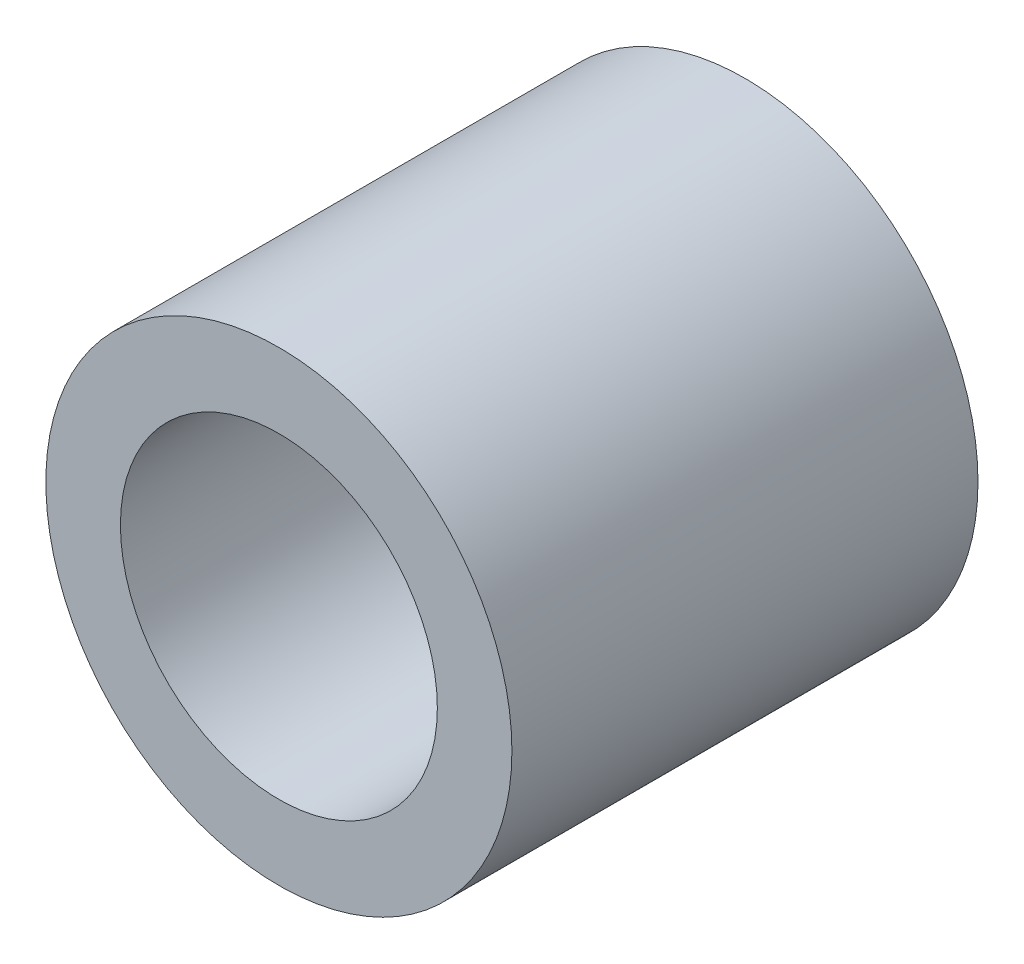
ISO-10303-21;
HEADER;
FILE_DESCRIPTION(('STEP AP214'),'2;1');
FILE_NAME('part.step','',(''),(''),'','','');
FILE_SCHEMA(('AUTOMOTIVE_DESIGN { 1 0 10303 214 1 1 1 1 }'));
ENDSEC;
DATA;
#1=APPLICATION_CONTEXT('core data for automotive mechanical design processes');
#2=APPLICATION_PROTOCOL_DEFINITION('international standard','automotive_design',2000,#1);
#3=PRODUCT_CONTEXT('',#1,'mechanical');
#4=PRODUCT('Part','Part','',(#3));
#5=PRODUCT_RELATED_PRODUCT_CATEGORY('part','',(#4));
#6=PRODUCT_DEFINITION_FORMATION('','',#4);
#7=PRODUCT_DEFINITION_CONTEXT('part definition',#1,'design');
#8=PRODUCT_DEFINITION('design','',#6,#7);
#9=PRODUCT_DEFINITION_SHAPE('','',#8);
#10=(LENGTH_UNIT() NAMED_UNIT(*) SI_UNIT(.MILLI.,.METRE.));
#11=(NAMED_UNIT(*) PLANE_ANGLE_UNIT() SI_UNIT($,.RADIAN.));
#12=(NAMED_UNIT(*) SI_UNIT($,.STERADIAN.) SOLID_ANGLE_UNIT());
#13=UNCERTAINTY_MEASURE_WITH_UNIT(LENGTH_MEASURE(1.E-05),#10,'distance_accuracy_value','');
#14=(GEOMETRIC_REPRESENTATION_CONTEXT(3) GLOBAL_UNCERTAINTY_ASSIGNED_CONTEXT((#13)) GLOBAL_UNIT_ASSIGNED_CONTEXT((#10,
#11,#12)) REPRESENTATION_CONTEXT('',''));
#15=CARTESIAN_POINT('',(0.,0.,0.));
#16=DIRECTION('',(0.,0.,1.));
#17=DIRECTION('',(1.,0.,0.));
#18=AXIS2_PLACEMENT_3D('',#15,#16,#17);
#19=CARTESIAN_POINT('',(0.,0.,2.5));
#20=DIRECTION('',(0.,0.,1.));
#21=DIRECTION('',(1.,0.,0.));
#22=AXIS2_PLACEMENT_3D('',#19,#20,#21);
#23=PLANE('',#22);
#24=CARTESIAN_POINT('',(0.,0.,2.5));
#25=DIRECTION('',(0.,0.,1.));
#26=DIRECTION('',(1.,0.,0.));
#27=AXIS2_PLACEMENT_3D('',#24,#25,#26);
#28=CIRCLE('',#27,2.5);
#29=CARTESIAN_POINT('',(2.5,0.,2.5));
#30=VERTEX_POINT('',#29);
#31=EDGE_CURVE('E10',#30,#30,#28,.T.);
#32=ORIENTED_EDGE('',*,*,#31,.T.);
#33=EDGE_LOOP('',(#32));
#34=FACE_BOUND('',#33,.T.);
#35=CARTESIAN_POINT('',(0.,0.,2.5));
#36=DIRECTION('',(0.,0.,1.));
#37=DIRECTION('',(1.,0.,0.));
#38=AXIS2_PLACEMENT_3D('',#35,#36,#37);
#39=CIRCLE('',#38,1.7);
#40=CARTESIAN_POINT('',(1.7,0.,2.5));
#41=VERTEX_POINT('',#40);
#42=EDGE_CURVE('E42',#41,#41,#39,.T.);
#43=ORIENTED_EDGE('',*,*,#42,.F.);
#44=EDGE_LOOP('',(#43));
#45=FACE_BOUND('',#44,.T.);
#46=ADVANCED_FACE('F31',(#34,#45),#23,.T.);
#47=CARTESIAN_POINT('',(0.,0.,-2.5));
#48=DIRECTION('',(0.,0.,1.));
#49=DIRECTION('',(1.,0.,0.));
#50=AXIS2_PLACEMENT_3D('',#47,#48,#49);
#51=PLANE('',#50);
#52=CARTESIAN_POINT('',(0.,0.,-2.5));
#53=DIRECTION('',(0.,0.,1.));
#54=DIRECTION('',(1.,0.,0.));
#55=AXIS2_PLACEMENT_3D('',#52,#53,#54);
#56=CIRCLE('',#55,2.5);
#57=CARTESIAN_POINT('',(2.5,0.,-2.5));
#58=VERTEX_POINT('',#57);
#59=EDGE_CURVE('E35',#58,#58,#56,.T.);
#60=ORIENTED_EDGE('',*,*,#59,.F.);
#61=EDGE_LOOP('',(#60));
#62=FACE_BOUND('',#61,.T.);
#63=CARTESIAN_POINT('',(0.,0.,-2.5));
#64=DIRECTION('',(0.,0.,1.));
#65=DIRECTION('',(1.,0.,0.));
#66=AXIS2_PLACEMENT_3D('',#63,#64,#65);
#67=CIRCLE('',#66,1.7);
#68=CARTESIAN_POINT('',(1.7,0.,-2.5));
#69=VERTEX_POINT('',#68);
#70=EDGE_CURVE('E44',#69,#69,#67,.T.);
#71=ORIENTED_EDGE('',*,*,#70,.T.);
#72=EDGE_LOOP('',(#71));
#73=FACE_BOUND('',#72,.T.);
#74=ADVANCED_FACE('F54',(#62,#73),#51,.F.);
#75=CARTESIAN_POINT('',(0.,0.,2.5));
#76=DIRECTION('',(0.,0.,-1.));
#77=DIRECTION('',(-1.,0.,0.));
#78=AXIS2_PLACEMENT_3D('',#75,#76,#77);
#79=CYLINDRICAL_SURFACE('',#78,2.5);
#80=ORIENTED_EDGE('',*,*,#31,.F.);
#81=EDGE_LOOP('',(#80));
#82=FACE_BOUND('',#81,.T.);
#83=ORIENTED_EDGE('',*,*,#59,.T.);
#84=EDGE_LOOP('',(#83));
#85=FACE_BOUND('',#84,.T.);
#86=ADVANCED_FACE('F33',(#82,#85),#79,.T.);
#87=CARTESIAN_POINT('',(0.,0.,2.5));
#88=DIRECTION('',(0.,0.,-1.));
#89=DIRECTION('',(-1.,0.,0.));
#90=AXIS2_PLACEMENT_3D('',#87,#88,#89);
#91=CYLINDRICAL_SURFACE('',#90,1.7);
#92=ORIENTED_EDGE('',*,*,#42,.T.);
#93=EDGE_LOOP('',(#92));
#94=FACE_BOUND('',#93,.T.);
#95=ORIENTED_EDGE('',*,*,#70,.F.);
#96=EDGE_LOOP('',(#95));
#97=FACE_BOUND('',#96,.T.);
#98=ADVANCED_FACE('F50',(#94,#97),#91,.F.);
#99=CLOSED_SHELL('',(#46,#74,#86,#98));
#100=MANIFOLD_SOLID_BREP('B2',#99);
#101=ADVANCED_BREP_SHAPE_REPRESENTATION('',(#18,#100),#14);
#102=SHAPE_DEFINITION_REPRESENTATION(#9,#101);
ENDSEC;
END-ISO-10303-21;
